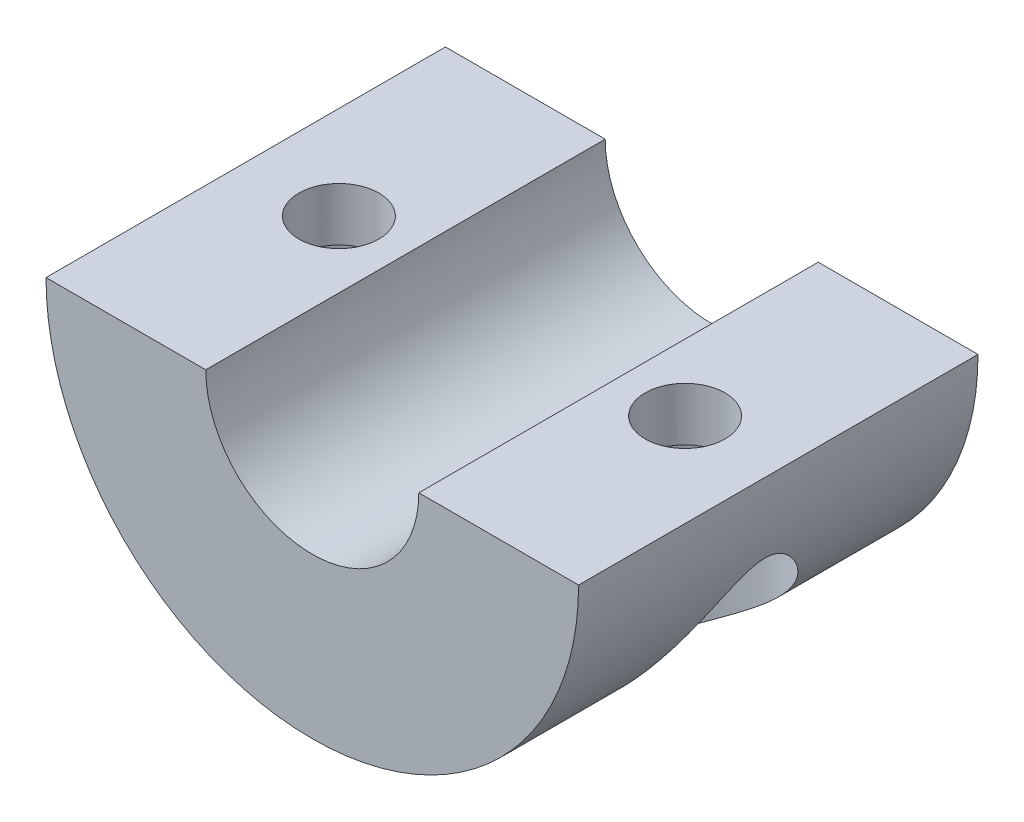
ISO-10303-21;
HEADER;
FILE_DESCRIPTION(('STEP AP214'),'2;1');
FILE_NAME('part.step','',(''),(''),'','','');
FILE_SCHEMA(('AUTOMOTIVE_DESIGN { 1 0 10303 214 1 1 1 1 }'));
ENDSEC;
DATA;
#1=APPLICATION_CONTEXT('core data for automotive mechanical design processes');
#2=APPLICATION_PROTOCOL_DEFINITION('international standard','automotive_design',2000,#1);
#3=PRODUCT_CONTEXT('',#1,'mechanical');
#4=PRODUCT('Part','Part','',(#3));
#5=PRODUCT_RELATED_PRODUCT_CATEGORY('part','',(#4));
#6=PRODUCT_DEFINITION_FORMATION('','',#4);
#7=PRODUCT_DEFINITION_CONTEXT('part definition',#1,'design');
#8=PRODUCT_DEFINITION('design','',#6,#7);
#9=PRODUCT_DEFINITION_SHAPE('','',#8);
#10=(LENGTH_UNIT() NAMED_UNIT(*) SI_UNIT(.MILLI.,.METRE.));
#11=(NAMED_UNIT(*) PLANE_ANGLE_UNIT() SI_UNIT($,.RADIAN.));
#12=(NAMED_UNIT(*) SI_UNIT($,.STERADIAN.) SOLID_ANGLE_UNIT());
#13=UNCERTAINTY_MEASURE_WITH_UNIT(LENGTH_MEASURE(1.E-05),#10,'distance_accuracy_value','');
#14=(GEOMETRIC_REPRESENTATION_CONTEXT(3) GLOBAL_UNCERTAINTY_ASSIGNED_CONTEXT((#13)) GLOBAL_UNIT_ASSIGNED_CONTEXT((#10,
#11,#12)) REPRESENTATION_CONTEXT('',''));
#15=CARTESIAN_POINT('',(0.,0.,0.));
#16=DIRECTION('',(0.,0.,1.));
#17=DIRECTION('',(1.,0.,0.));
#18=AXIS2_PLACEMENT_3D('',#15,#16,#17);
#19=CARTESIAN_POINT('',(0.,0.,15.));
#20=DIRECTION('',(0.,0.,-1.));
#21=DIRECTION('',(-1.,0.,0.));
#22=AXIS2_PLACEMENT_3D('',#19,#20,#21);
#23=CYLINDRICAL_SURFACE('',#22,10.);
#24=CARTESIAN_POINT('',(6.5,-7.59934207678533,10.5));
#25=CARTESIAN_POINT('',(6.59626715384264,-7.51700303567221,10.5000006640346));
#26=CARTESIAN_POINT('',(6.69093967772674,-7.43285082252878,10.4953695217262));
#27=CARTESIAN_POINT('',(6.87661285292257,-7.26141739125339,10.4777271730348));
#28=CARTESIAN_POINT('',(6.96761246144658,-7.1741352976071,10.4647136043123));
#29=CARTESIAN_POINT('',(7.23493475236577,-6.90788942408736,10.4142466292948));
#30=CARTESIAN_POINT('',(7.40518383760093,-6.72486661682442,10.3653736662432));
#31=CARTESIAN_POINT('',(7.68867402631341,-6.39682912863218,10.2575688822087));
#32=CARTESIAN_POINT('',(7.80576283098996,-6.25329061773006,10.203903839753));
#33=CARTESIAN_POINT('',(8.02952394207204,-5.96324296475205,10.0839264255998));
#34=CARTESIAN_POINT('',(8.13619015079449,-5.81673214355232,10.0176067165575));
#35=CARTESIAN_POINT('',(8.33872059113446,-5.52246166128028,9.87371165301168));
#36=CARTESIAN_POINT('',(8.43461119945645,-5.37470604541703,9.79616489548227));
#37=CARTESIAN_POINT('',(8.6159203073229,-5.07897155540084,9.6302551592152));
#38=CARTESIAN_POINT('',(8.70134480448516,-4.93099285877142,9.54189843371511));
#39=CARTESIAN_POINT('',(8.84838760410095,-4.66106986441501,9.36966930513917));
#40=CARTESIAN_POINT('',(8.91160031899074,-4.53889893336957,9.28750591953785));
#41=CARTESIAN_POINT('',(9.03098770854562,-4.29645814872203,9.11408550106013));
#42=CARTESIAN_POINT('',(9.08712627965559,-4.1762005839669,9.02278577446811));
#43=CARTESIAN_POINT('',(9.17172857309055,-3.98569744218155,8.86619503359302));
#44=CARTESIAN_POINT('',(9.20260310486306,-3.9138103581973,8.80420214171844));
#45=CARTESIAN_POINT('',(9.26117854725035,-3.77311146248531,8.67513045035976));
#46=CARTESIAN_POINT('',(9.28887480961871,-3.70430424251208,8.60804443434438));
#47=CARTESIAN_POINT('',(9.34040872293033,-3.57235677276185,8.46829059486594));
#48=CARTESIAN_POINT('',(9.36427848881603,-3.50917158056839,8.39567769719094));
#49=CARTESIAN_POINT('',(9.40764932791933,-3.39117089787046,8.24287329581013));
#50=CARTESIAN_POINT('',(9.42716583046272,-3.33632607385045,8.16271003812605));
#51=CARTESIAN_POINT('',(9.45451038311707,-3.25780812243611,8.02339669252767));
#52=CARTESIAN_POINT('',(9.46402434226795,-3.22999487337996,7.96695371318277));
#53=CARTESIAN_POINT('',(9.48005592757253,-3.18263506455229,7.85030378409398));
#54=CARTESIAN_POINT('',(9.48658008524816,-3.16307049227395,7.7901053687648));
#55=CARTESIAN_POINT('',(9.49530138001083,-3.13678497395271,7.67591748799047));
#56=CARTESIAN_POINT('',(9.49799244555997,-3.12860220966917,7.62231060855095));
#57=CARTESIAN_POINT('',(9.50044997332594,-3.12113263710684,7.51439546101367));
#58=CARTESIAN_POINT('',(9.50021701993901,-3.12184405123191,7.46008733523486));
#59=CARTESIAN_POINT('',(9.49685706368595,-3.13204883911273,7.35255624726779));
#60=CARTESIAN_POINT('',(9.49373686481757,-3.14152156619114,7.29933103437585));
#61=CARTESIAN_POINT('',(9.48492080217995,-3.16803889305328,7.19504804231814));
#62=CARTESIAN_POINT('',(9.47922263955615,-3.18509025071036,7.14399224223662));
#63=CARTESIAN_POINT('',(9.46132809841256,-3.2379699412791,7.01286403189659));
#64=CARTESIAN_POINT('',(9.44730614410694,-3.27883393143574,6.9351019983162));
#65=CARTESIAN_POINT('',(9.41496027653454,-3.37059503779214,6.78668335391714));
#66=CARTESIAN_POINT('',(9.39661941225216,-3.42153155745284,6.71605634910341));
#67=CARTESIAN_POINT('',(9.35042735793383,-3.54614670603331,6.56001648170062));
#68=CARTESIAN_POINT('',(9.32138551893846,-3.62200443626901,6.47672761249256));
#69=CARTESIAN_POINT('',(9.25858023831557,-3.7796759574645,6.3178286441864));
#70=CARTESIAN_POINT('',(9.22480788785814,-3.8615008434825,6.24223350934331));
#71=CARTESIAN_POINT('',(9.15287833256062,-4.02904092446296,6.09684729116866));
#72=CARTESIAN_POINT('',(9.11470088762099,-4.11477288542036,6.02708576222991));
#73=CARTESIAN_POINT('',(9.03436338843595,-4.28829000162744,5.89279458050797));
#74=CARTESIAN_POINT('',(8.99220613709566,-4.3760736795861,5.82826130421026));
#75=CARTESIAN_POINT('',(8.87157124715262,-4.6178511373522,5.6579303976404));
#76=CARTESIAN_POINT('',(8.78916799578506,-4.77309749949032,5.55665649141777));
#77=CARTESIAN_POINT('',(8.61275226204894,-5.08454783167265,5.36620014677272));
#78=CARTESIAN_POINT('',(8.51873054086025,-5.24075246870338,5.27702745079548));
#79=CARTESIAN_POINT('',(8.31932041689995,-5.55183945128257,5.1111003670292));
#80=CARTESIAN_POINT('',(8.21396340470958,-5.70672422889573,5.03431308467524));
#81=CARTESIAN_POINT('',(7.99175387934405,-6.0139723048799,4.89386508317436));
#82=CARTESIAN_POINT('',(7.87490846272541,-6.1663370927674,4.83019633483589));
#83=CARTESIAN_POINT('',(7.57666959505563,-6.532307879117,4.69320325468493));
#84=CARTESIAN_POINT('',(7.38915992478216,-6.74400799656451,4.62754286396326));
#85=CARTESIAN_POINT('',(7.09164529829815,-7.05187937475232,4.55716048999194));
#86=CARTESIAN_POINT('',(6.98979027246551,-7.15286828971545,4.53838547117163));
#87=CARTESIAN_POINT('',(6.78111234837324,-7.35100157323475,4.51134485915088));
#88=CARTESIAN_POINT('',(6.67429082789259,-7.44814699435365,4.5030763691045));
#89=CARTESIAN_POINT('',(6.39833634615838,-7.68830366319808,4.49708687674687));
#90=CARTESIAN_POINT('',(6.22621350041297,-7.82830311707535,4.50728965543184));
#91=CARTESIAN_POINT('',(5.96393083171256,-8.02768199851318,4.54695952978306));
#92=CARTESIAN_POINT('',(5.87583085574082,-8.09236456329553,4.56424029317027));
#93=CARTESIAN_POINT('',(5.69901597336694,-8.21784453660574,4.60747192770032));
#94=CARTESIAN_POINT('',(5.61030116986628,-8.27864257865896,4.63342138074802));
#95=CARTESIAN_POINT('',(5.3743145097719,-8.4349161145622,4.71485109753006));
#96=CARTESIAN_POINT('',(5.22720558761511,-8.52666561390853,4.77850454018129));
#97=CARTESIAN_POINT('',(5.01146503169386,-8.65403305366947,4.8940534751946));
#98=CARTESIAN_POINT('',(4.94034341067357,-8.69479422495471,4.93593619609538));
#99=CARTESIAN_POINT('',(4.80049131796222,-8.77277969980534,5.02642132480074));
#100=CARTESIAN_POINT('',(4.73175971247948,-8.8100056953296,5.07502049044429));
#101=CARTESIAN_POINT('',(4.59709927592574,-8.88102000393527,5.17916830792296));
#102=CARTESIAN_POINT('',(4.53118975729369,-8.91478632781373,5.23475694475193));
#103=CARTESIAN_POINT('',(4.40349349404765,-8.97854861013236,5.35239819792941));
#104=CARTESIAN_POINT('',(4.34170494823738,-9.0085462209371,5.41444795946783));
#105=CARTESIAN_POINT('',(4.22305201854264,-9.06477494868528,5.54468341661882));
#106=CARTESIAN_POINT('',(4.16618789835973,-9.09100586397272,5.61286944042824));
#107=CARTESIAN_POINT('',(4.05819522570229,-9.13972429775995,5.75484705584869));
#108=CARTESIAN_POINT('',(4.00706611764591,-9.16221217897016,5.82863810330695));
#109=CARTESIAN_POINT('',(3.87283746114096,-9.22008601716353,6.0425032265752));
#110=CARTESIAN_POINT('',(3.79692266657876,-9.25138037014034,6.18833746250217));
#111=CARTESIAN_POINT('',(3.66958818177695,-9.30262770811066,6.49207253287504));
#112=CARTESIAN_POINT('',(3.61816180085322,-9.32258379121578,6.64997005771163));
#113=CARTESIAN_POINT('',(3.54361672115193,-9.35116600364364,6.96611505224467));
#114=CARTESIAN_POINT('',(3.51938235107745,-9.36023981739045,7.12405928211684));
#115=CARTESIAN_POINT('',(3.49632743450426,-9.36887698617571,7.44203908175331));
#116=CARTESIAN_POINT('',(3.49750451912467,-9.36844122770583,7.60207445518914));
#117=CARTESIAN_POINT('',(3.52509925333944,-9.35809172532091,7.91824870464915));
#118=CARTESIAN_POINT('',(3.55129999819226,-9.34825942999295,8.07440924294505));
#119=CARTESIAN_POINT('',(3.62759872576983,-9.31891532020625,8.37981905221234));
#120=CARTESIAN_POINT('',(3.67769558661327,-9.29940396016116,8.52906864727969));
#121=CARTESIAN_POINT('',(3.79989955969764,-9.25013971995249,8.81678827788082));
#122=CARTESIAN_POINT('',(3.87204867847548,-9.22036727990168,8.95523710209174));
#123=CARTESIAN_POINT('',(4.03535390132151,-9.15007050794186,9.21737247298131));
#124=CARTESIAN_POINT('',(4.1265093967466,-9.1095465203194,9.34105949217934));
#125=CARTESIAN_POINT('',(4.32579271769409,-9.01663871601212,9.57281976190138));
#126=CARTESIAN_POINT('',(4.43418673615323,-8.9640619635354,9.68058608673868));
#127=CARTESIAN_POINT('',(4.66232393958377,-8.84754923711741,9.87603229853336));
#128=CARTESIAN_POINT('',(4.78206929222544,-8.78361109153821,9.96370833804759));
#129=CARTESIAN_POINT('',(5.03575113427153,-8.64081053994456,10.1229220320811));
#130=CARTESIAN_POINT('',(5.17010806982663,-8.56128676750944,10.193190038055));
#131=CARTESIAN_POINT('',(5.44172101513837,-8.39126712530108,10.3110483033674));
#132=CARTESIAN_POINT('',(5.57897794218784,-8.30076773960438,10.3586312715926));
#133=CARTESIAN_POINT('',(5.84912493781439,-8.112595097033,10.4318048626014));
#134=CARTESIAN_POINT('',(5.98203996481213,-8.01515014237334,10.4579027168877));
#135=CARTESIAN_POINT('',(6.24422105879918,-7.8126273826344,10.4919987947564));
#136=CARTESIAN_POINT('',(6.37348754923774,-7.7075504684208,10.4999991273385));
#137=CARTESIAN_POINT('',(6.5,-7.59934207678533,10.5));
#138=B_SPLINE_CURVE_WITH_KNOTS('',3,(#24,#25,#26,#27,#28,#29,#30,#31,#32,#33,#34,#35,#36,#37,
#38,#39,#40,#41,#42,#43,#44,#45,#46,#47,#48,#49,#50,#51,#52,#53,#54,#55,#56,#57,#58,#59,#60,#61,
#62,#63,#64,#65,#66,#67,#68,#69,#70,#71,#72,#73,#74,#75,#76,#77,#78,#79,#80,#81,#82,#83,#84,#85,
#86,#87,#88,#89,#90,#91,#92,#93,#94,#95,#96,#97,#98,#99,#100,#101,#102,#103,#104,#105,#106,#107,
#108,#109,#110,#111,#112,#113,#114,#115,#116,#117,#118,#119,#120,#121,#122,#123,#124,#125,#126,
#127,#128,#129,#130,#131,#132,#133,#134,#135,#136,#137),.UNSPECIFIED.,.T.,.F.,(4,2,2,2,2,2,2,2,
2,2,2,2,2,2,2,2,2,2,2,2,2,2,2,2,2,2,2,2,2,2,2,2,2,2,2,2,2,2,2,2,2,2,2,2,2,2,2,2,2,2,2,2,2,2,2,2,
4),(0.,0.379875271141809,0.759857645790385,1.52137704889893,2.09927960416235,2.67751825886669,
3.2543091530681,3.83076795502686,4.31110294894101,4.79379782004087,5.09309365086966,
5.3928217712735,5.68988523917638,5.98587847276474,6.17626684446677,6.36623728730627,
6.52837367438081,6.69047765729257,6.85220060093952,7.01406804334216,7.27939037850948,
7.54577194693962,7.8939953230852,8.24288354278009,8.59344392697611,8.94375923405327,
9.55149441766768,10.1597160104145,10.7662946302688,11.3725008839139,12.2399596101564,
12.6734929343532,13.1069066993705,13.7702764258442,14.1018829696336,14.4334352930563,
14.9847505778033,15.2606379559994,15.5363926200574,15.8138034428302,16.0910922092214,
16.3683958151748,16.6456725339739,17.1449845358862,17.6441600382085,18.122006166987,
18.5998077506702,19.0735049916337,19.5471799955198,20.0217629689407,20.4963307470772,
20.9791035186973,21.4619686678657,21.9735464742427,22.485288594268,22.9845715908274,
23.4837964003059),.UNSPECIFIED.);
#139=CARTESIAN_POINT('',(6.5,-7.59934207678533,10.5));
#140=VERTEX_POINT('',#139);
#141=EDGE_CURVE('E113',#140,#140,#138,.T.);
#142=ORIENTED_EDGE('',*,*,#141,.T.);
#143=EDGE_LOOP('',(#142));
#144=FACE_BOUND('',#143,.T.);
#145=CARTESIAN_POINT('',(0.,0.,0.));
#146=DIRECTION('',(0.,0.,1.));
#147=DIRECTION('',(1.,0.,0.));
#148=AXIS2_PLACEMENT_3D('',#145,#146,#147);
#149=CIRCLE('',#148,10.);
#150=CARTESIAN_POINT('',(-10.,0.,0.));
#151=VERTEX_POINT('',#150);
#152=CARTESIAN_POINT('',(10.,0.,0.));
#153=VERTEX_POINT('',#152);
#154=EDGE_CURVE('E110',#151,#153,#149,.T.);
#155=ORIENTED_EDGE('',*,*,#154,.T.);
#156=DIRECTION('',(0.,0.,-1.));
#157=VECTOR('',#156,1.);
#158=CARTESIAN_POINT('',(10.,0.,15.));
#159=LINE('',#158,#157);
#160=CARTESIAN_POINT('',(10.,0.,15.));
#161=VERTEX_POINT('',#160);
#162=EDGE_CURVE('E74',#161,#153,#159,.T.);
#163=ORIENTED_EDGE('',*,*,#162,.F.);
#164=CARTESIAN_POINT('',(0.,0.,15.));
#165=DIRECTION('',(0.,0.,1.));
#166=DIRECTION('',(1.,0.,0.));
#167=AXIS2_PLACEMENT_3D('',#164,#165,#166);
#168=CIRCLE('',#167,10.);
#169=CARTESIAN_POINT('',(-10.,0.,15.));
#170=VERTEX_POINT('',#169);
#171=EDGE_CURVE('E96',#170,#161,#168,.T.);
#172=ORIENTED_EDGE('',*,*,#171,.F.);
#173=DIRECTION('',(0.,0.,-1.));
#174=VECTOR('',#173,1.);
#175=CARTESIAN_POINT('',(-10.,0.,15.));
#176=LINE('',#175,#174);
#177=EDGE_CURVE('E51',#170,#151,#176,.T.);
#178=ORIENTED_EDGE('',*,*,#177,.T.);
#179=EDGE_LOOP('',(#155,#163,#172,#178));
#180=FACE_BOUND('',#179,.T.);
#181=CARTESIAN_POINT('',(-6.5,-7.59934207678533,10.5));
#182=CARTESIAN_POINT('',(-6.59626715384264,-7.51700303567221,10.5000006640346));
#183=CARTESIAN_POINT('',(-6.69093967772674,-7.43285082252878,10.4953695217262));
#184=CARTESIAN_POINT('',(-6.87661285292257,-7.26141739125339,10.4777271730348));
#185=CARTESIAN_POINT('',(-6.96761246144658,-7.1741352976071,10.4647136043123));
#186=CARTESIAN_POINT('',(-7.23493475236577,-6.90788942408736,10.4142466292948));
#187=CARTESIAN_POINT('',(-7.40518383760093,-6.72486661682442,10.3653736662432));
#188=CARTESIAN_POINT('',(-7.68867402631341,-6.39682912863218,10.2575688822087));
#189=CARTESIAN_POINT('',(-7.80576283098996,-6.25329061773006,10.203903839753));
#190=CARTESIAN_POINT('',(-8.02952394207204,-5.96324296475205,10.0839264255998));
#191=CARTESIAN_POINT('',(-8.13619015079449,-5.81673214355232,10.0176067165575));
#192=CARTESIAN_POINT('',(-8.33872059113446,-5.52246166128028,9.87371165301168));
#193=CARTESIAN_POINT('',(-8.43461119945645,-5.37470604541703,9.79616489548227));
#194=CARTESIAN_POINT('',(-8.6159203073229,-5.07897155540084,9.6302551592152));
#195=CARTESIAN_POINT('',(-8.70134480448516,-4.93099285877142,9.54189843371511));
#196=CARTESIAN_POINT('',(-8.84838760410095,-4.66106986441501,9.36966930513917));
#197=CARTESIAN_POINT('',(-8.91160031899074,-4.53889893336957,9.28750591953785));
#198=CARTESIAN_POINT('',(-9.03098770854562,-4.29645814872203,9.11408550106013));
#199=CARTESIAN_POINT('',(-9.08712627965559,-4.1762005839669,9.02278577446811));
#200=CARTESIAN_POINT('',(-9.17172857309055,-3.98569744218155,8.86619503359302));
#201=CARTESIAN_POINT('',(-9.20260310486306,-3.9138103581973,8.80420214171844));
#202=CARTESIAN_POINT('',(-9.26117854725035,-3.77311146248531,8.67513045035976));
#203=CARTESIAN_POINT('',(-9.28887480961871,-3.70430424251208,8.60804443434438));
#204=CARTESIAN_POINT('',(-9.34040872293033,-3.57235677276185,8.46829059486594));
#205=CARTESIAN_POINT('',(-9.36427848881603,-3.50917158056839,8.39567769719094));
#206=CARTESIAN_POINT('',(-9.40764932791933,-3.39117089787046,8.24287329581013));
#207=CARTESIAN_POINT('',(-9.42716583046272,-3.33632607385045,8.16271003812605));
#208=CARTESIAN_POINT('',(-9.45451038311707,-3.25780812243611,8.02339669252767));
#209=CARTESIAN_POINT('',(-9.46402434226795,-3.22999487337996,7.96695371318277));
#210=CARTESIAN_POINT('',(-9.48005592757253,-3.18263506455229,7.85030378409398));
#211=CARTESIAN_POINT('',(-9.48658008524816,-3.16307049227395,7.7901053687648));
#212=CARTESIAN_POINT('',(-9.49530138001083,-3.13678497395271,7.67591748799047));
#213=CARTESIAN_POINT('',(-9.49799244555997,-3.12860220966917,7.62231060855095));
#214=CARTESIAN_POINT('',(-9.50044997332594,-3.12113263710684,7.51439546101367));
#215=CARTESIAN_POINT('',(-9.50021701993901,-3.12184405123191,7.46008733523486));
#216=CARTESIAN_POINT('',(-9.49685706368595,-3.13204883911273,7.35255624726779));
#217=CARTESIAN_POINT('',(-9.49373686481757,-3.14152156619114,7.29933103437585));
#218=CARTESIAN_POINT('',(-9.48492080217995,-3.16803889305328,7.19504804231814));
#219=CARTESIAN_POINT('',(-9.47922263955615,-3.18509025071036,7.14399224223662));
#220=CARTESIAN_POINT('',(-9.46132809841256,-3.2379699412791,7.01286403189659));
#221=CARTESIAN_POINT('',(-9.44730614410694,-3.27883393143574,6.9351019983162));
#222=CARTESIAN_POINT('',(-9.41496027653454,-3.37059503779214,6.78668335391714));
#223=CARTESIAN_POINT('',(-9.39661941225216,-3.42153155745284,6.71605634910341));
#224=CARTESIAN_POINT('',(-9.35042735793383,-3.54614670603331,6.56001648170062));
#225=CARTESIAN_POINT('',(-9.32138551893846,-3.62200443626901,6.47672761249256));
#226=CARTESIAN_POINT('',(-9.25858023831557,-3.7796759574645,6.3178286441864));
#227=CARTESIAN_POINT('',(-9.22480788785814,-3.8615008434825,6.24223350934331));
#228=CARTESIAN_POINT('',(-9.15287833256062,-4.02904092446296,6.09684729116866));
#229=CARTESIAN_POINT('',(-9.11470088762099,-4.11477288542036,6.02708576222991));
#230=CARTESIAN_POINT('',(-9.03436338843595,-4.28829000162744,5.89279458050797));
#231=CARTESIAN_POINT('',(-8.99220613709566,-4.3760736795861,5.82826130421026));
#232=CARTESIAN_POINT('',(-8.87157124715262,-4.6178511373522,5.6579303976404));
#233=CARTESIAN_POINT('',(-8.78916799578506,-4.77309749949032,5.55665649141777));
#234=CARTESIAN_POINT('',(-8.61275226204894,-5.08454783167265,5.36620014677272));
#235=CARTESIAN_POINT('',(-8.51873054086025,-5.24075246870338,5.27702745079548));
#236=CARTESIAN_POINT('',(-8.31932041689995,-5.55183945128257,5.1111003670292));
#237=CARTESIAN_POINT('',(-8.21396340470958,-5.70672422889573,5.03431308467524));
#238=CARTESIAN_POINT('',(-7.99175387934405,-6.0139723048799,4.89386508317436));
#239=CARTESIAN_POINT('',(-7.87490846272541,-6.1663370927674,4.83019633483589));
#240=CARTESIAN_POINT('',(-7.57666959505563,-6.532307879117,4.69320325468493));
#241=CARTESIAN_POINT('',(-7.38915992478216,-6.74400799656451,4.62754286396326));
#242=CARTESIAN_POINT('',(-7.09164529829815,-7.05187937475232,4.55716048999194));
#243=CARTESIAN_POINT('',(-6.98979027246551,-7.15286828971545,4.53838547117163));
#244=CARTESIAN_POINT('',(-6.78111234837324,-7.35100157323475,4.51134485915088));
#245=CARTESIAN_POINT('',(-6.67429082789259,-7.44814699435365,4.5030763691045));
#246=CARTESIAN_POINT('',(-6.39833634615838,-7.68830366319808,4.49708687674687));
#247=CARTESIAN_POINT('',(-6.22621350041297,-7.82830311707535,4.50728965543184));
#248=CARTESIAN_POINT('',(-5.96393083171256,-8.02768199851318,4.54695952978306));
#249=CARTESIAN_POINT('',(-5.87583085574082,-8.09236456329553,4.56424029317027));
#250=CARTESIAN_POINT('',(-5.69901597336694,-8.21784453660574,4.60747192770032));
#251=CARTESIAN_POINT('',(-5.61030116986628,-8.27864257865896,4.63342138074802));
#252=CARTESIAN_POINT('',(-5.3743145097719,-8.4349161145622,4.71485109753006));
#253=CARTESIAN_POINT('',(-5.22720558761511,-8.52666561390853,4.77850454018129));
#254=CARTESIAN_POINT('',(-5.01146503169386,-8.65403305366947,4.8940534751946));
#255=CARTESIAN_POINT('',(-4.94034341067357,-8.69479422495471,4.93593619609538));
#256=CARTESIAN_POINT('',(-4.80049131796222,-8.77277969980534,5.02642132480074));
#257=CARTESIAN_POINT('',(-4.73175971247948,-8.8100056953296,5.07502049044429));
#258=CARTESIAN_POINT('',(-4.59709927592574,-8.88102000393527,5.17916830792296));
#259=CARTESIAN_POINT('',(-4.53118975729369,-8.91478632781373,5.23475694475193));
#260=CARTESIAN_POINT('',(-4.40349349404765,-8.97854861013236,5.35239819792941));
#261=CARTESIAN_POINT('',(-4.34170494823738,-9.0085462209371,5.41444795946783));
#262=CARTESIAN_POINT('',(-4.22305201854264,-9.06477494868528,5.54468341661882));
#263=CARTESIAN_POINT('',(-4.16618789835973,-9.09100586397272,5.61286944042824));
#264=CARTESIAN_POINT('',(-4.05819522570229,-9.13972429775995,5.75484705584869));
#265=CARTESIAN_POINT('',(-4.00706611764591,-9.16221217897016,5.82863810330695));
#266=CARTESIAN_POINT('',(-3.87283746114096,-9.22008601716353,6.0425032265752));
#267=CARTESIAN_POINT('',(-3.79692266657876,-9.25138037014034,6.18833746250217));
#268=CARTESIAN_POINT('',(-3.66958818177695,-9.30262770811066,6.49207253287504));
#269=CARTESIAN_POINT('',(-3.61816180085322,-9.32258379121578,6.64997005771163));
#270=CARTESIAN_POINT('',(-3.54361672115193,-9.35116600364364,6.96611505224467));
#271=CARTESIAN_POINT('',(-3.51938235107745,-9.36023981739045,7.12405928211684));
#272=CARTESIAN_POINT('',(-3.49632743450426,-9.36887698617571,7.44203908175331));
#273=CARTESIAN_POINT('',(-3.49750451912467,-9.36844122770583,7.60207445518914));
#274=CARTESIAN_POINT('',(-3.52509925333944,-9.35809172532091,7.91824870464915));
#275=CARTESIAN_POINT('',(-3.55129999819226,-9.34825942999295,8.07440924294505));
#276=CARTESIAN_POINT('',(-3.62759872576983,-9.31891532020625,8.37981905221234));
#277=CARTESIAN_POINT('',(-3.67769558661327,-9.29940396016116,8.52906864727969));
#278=CARTESIAN_POINT('',(-3.79989955969764,-9.25013971995249,8.81678827788082));
#279=CARTESIAN_POINT('',(-3.87204867847548,-9.22036727990168,8.95523710209174));
#280=CARTESIAN_POINT('',(-4.03535390132151,-9.15007050794186,9.21737247298131));
#281=CARTESIAN_POINT('',(-4.1265093967466,-9.1095465203194,9.34105949217934));
#282=CARTESIAN_POINT('',(-4.32579271769409,-9.01663871601212,9.57281976190138));
#283=CARTESIAN_POINT('',(-4.43418673615323,-8.9640619635354,9.68058608673868));
#284=CARTESIAN_POINT('',(-4.66232393958377,-8.84754923711741,9.87603229853336));
#285=CARTESIAN_POINT('',(-4.78206929222544,-8.78361109153821,9.96370833804759));
#286=CARTESIAN_POINT('',(-5.03575113427153,-8.64081053994456,10.1229220320811));
#287=CARTESIAN_POINT('',(-5.17010806982663,-8.56128676750944,10.193190038055));
#288=CARTESIAN_POINT('',(-5.44172101513837,-8.39126712530108,10.3110483033674));
#289=CARTESIAN_POINT('',(-5.57897794218784,-8.30076773960438,10.3586312715926));
#290=CARTESIAN_POINT('',(-5.84912493781439,-8.112595097033,10.4318048626014));
#291=CARTESIAN_POINT('',(-5.98203996481213,-8.01515014237334,10.4579027168877));
#292=CARTESIAN_POINT('',(-6.24422105879918,-7.8126273826344,10.4919987947564));
#293=CARTESIAN_POINT('',(-6.37348754923774,-7.7075504684208,10.4999991273385));
#294=CARTESIAN_POINT('',(-6.5,-7.59934207678533,10.5));
#295=B_SPLINE_CURVE_WITH_KNOTS('',3,(#181,#182,#183,#184,#185,#186,#187,#188,#189,#190,#191,
#192,#193,#194,#195,#196,#197,#198,#199,#200,#201,#202,#203,#204,#205,#206,#207,#208,#209,#210,
#211,#212,#213,#214,#215,#216,#217,#218,#219,#220,#221,#222,#223,#224,#225,#226,#227,#228,#229,
#230,#231,#232,#233,#234,#235,#236,#237,#238,#239,#240,#241,#242,#243,#244,#245,#246,#247,#248,
#249,#250,#251,#252,#253,#254,#255,#256,#257,#258,#259,#260,#261,#262,#263,#264,#265,#266,#267,
#268,#269,#270,#271,#272,#273,#274,#275,#276,#277,#278,#279,#280,#281,#282,#283,#284,#285,#286,
#287,#288,#289,#290,#291,#292,#293,#294),.UNSPECIFIED.,.T.,.F.,(4,2,2,2,2,2,2,2,2,2,2,2,2,2,2,2,
2,2,2,2,2,2,2,2,2,2,2,2,2,2,2,2,2,2,2,2,2,2,2,2,2,2,2,2,2,2,2,2,2,2,2,2,2,2,2,2,4),(0.,
0.379875271141809,0.759857645790385,1.52137704889893,2.09927960416235,2.67751825886669,
3.2543091530681,3.83076795502686,4.31110294894101,4.79379782004087,5.09309365086966,
5.3928217712735,5.68988523917638,5.98587847276474,6.17626684446677,6.36623728730627,
6.52837367438081,6.69047765729257,6.85220060093952,7.01406804334216,7.27939037850948,
7.54577194693962,7.8939953230852,8.24288354278009,8.59344392697611,8.94375923405327,
9.55149441766768,10.1597160104145,10.7662946302688,11.3725008839139,12.2399596101564,
12.6734929343532,13.1069066993705,13.7702764258442,14.1018829696336,14.4334352930563,
14.9847505778033,15.2606379559994,15.5363926200574,15.8138034428302,16.0910922092214,
16.3683958151748,16.6456725339739,17.1449845358862,17.6441600382085,18.122006166987,
18.5998077506702,19.0735049916337,19.5471799955198,20.0217629689407,20.4963307470772,
20.9791035186973,21.4619686678657,21.9735464742427,22.485288594268,22.9845715908274,
23.4837964003059),.UNSPECIFIED.);
#296=CARTESIAN_POINT('',(-6.5,-7.59934207678533,10.5));
#297=VERTEX_POINT('',#296);
#298=EDGE_CURVE('E204',#297,#297,#295,.T.);
#299=ORIENTED_EDGE('',*,*,#298,.F.);
#300=EDGE_LOOP('',(#299));
#301=FACE_BOUND('',#300,.T.);
#302=ADVANCED_FACE('F41',(#144,#180,#301),#23,.T.);
#303=CARTESIAN_POINT('',(0.,0.,15.));
#304=DIRECTION('',(0.,0.,-1.));
#305=DIRECTION('',(-1.,0.,0.));
#306=AXIS2_PLACEMENT_3D('',#303,#304,#305);
#307=CYLINDRICAL_SURFACE('',#306,4.);
#308=CARTESIAN_POINT('',(0.,0.,0.));
#309=DIRECTION('',(0.,0.,1.));
#310=DIRECTION('',(1.,0.,0.));
#311=AXIS2_PLACEMENT_3D('',#308,#309,#310);
#312=CIRCLE('',#311,4.);
#313=CARTESIAN_POINT('',(-4.,0.,0.));
#314=VERTEX_POINT('',#313);
#315=CARTESIAN_POINT('',(4.,0.,0.));
#316=VERTEX_POINT('',#315);
#317=EDGE_CURVE('E119',#314,#316,#312,.T.);
#318=ORIENTED_EDGE('',*,*,#317,.F.);
#319=DIRECTION('',(0.,0.,-1.));
#320=VECTOR('',#319,1.);
#321=CARTESIAN_POINT('',(-4.,0.,15.));
#322=LINE('',#321,#320);
#323=CARTESIAN_POINT('',(-4.,0.,15.));
#324=VERTEX_POINT('',#323);
#325=EDGE_CURVE('E11',#324,#314,#322,.T.);
#326=ORIENTED_EDGE('',*,*,#325,.F.);
#327=CARTESIAN_POINT('',(0.,0.,15.));
#328=DIRECTION('',(0.,0.,1.));
#329=DIRECTION('',(1.,0.,0.));
#330=AXIS2_PLACEMENT_3D('',#327,#328,#329);
#331=CIRCLE('',#330,4.);
#332=CARTESIAN_POINT('',(4.,0.,15.));
#333=VERTEX_POINT('',#332);
#334=EDGE_CURVE('E103',#324,#333,#331,.T.);
#335=ORIENTED_EDGE('',*,*,#334,.T.);
#336=DIRECTION('',(0.,0.,-1.));
#337=VECTOR('',#336,1.);
#338=CARTESIAN_POINT('',(4.,0.,15.));
#339=LINE('',#338,#337);
#340=EDGE_CURVE('E60',#333,#316,#339,.T.);
#341=ORIENTED_EDGE('',*,*,#340,.T.);
#342=EDGE_LOOP('',(#318,#326,#335,#341));
#343=FACE_BOUND('',#342,.T.);
#344=ADVANCED_FACE('F43',(#343),#307,.F.);
#345=CARTESIAN_POINT('',(0.,0.,15.));
#346=DIRECTION('',(0.,1.,0.));
#347=DIRECTION('',(0.,0.,1.));
#348=AXIS2_PLACEMENT_3D('',#345,#346,#347);
#349=PLANE('',#348);
#350=CARTESIAN_POINT('',(-6.5,0.,7.5));
#351=DIRECTION('',(0.,1.,0.));
#352=DIRECTION('',(0.,0.,1.));
#353=AXIS2_PLACEMENT_3D('',#350,#351,#352);
#354=CIRCLE('',#353,1.5);
#355=CARTESIAN_POINT('',(-6.5,0.,9.));
#356=VERTEX_POINT('',#355);
#357=EDGE_CURVE('E45',#356,#356,#354,.F.);
#358=ORIENTED_EDGE('',*,*,#357,.T.);
#359=EDGE_LOOP('',(#358));
#360=FACE_BOUND('',#359,.T.);
#361=DIRECTION('',(1.,0.,0.));
#362=VECTOR('',#361,1.);
#363=CARTESIAN_POINT('',(0.,0.,0.));
#364=LINE('',#363,#362);
#365=EDGE_CURVE('E92',#151,#314,#364,.T.);
#366=ORIENTED_EDGE('',*,*,#365,.F.);
#367=ORIENTED_EDGE('',*,*,#177,.F.);
#368=DIRECTION('',(1.,0.,0.));
#369=VECTOR('',#368,1.);
#370=CARTESIAN_POINT('',(0.,0.,15.));
#371=LINE('',#370,#369);
#372=EDGE_CURVE('E90',#170,#324,#371,.T.);
#373=ORIENTED_EDGE('',*,*,#372,.T.);
#374=ORIENTED_EDGE('',*,*,#325,.T.);
#375=EDGE_LOOP('',(#366,#367,#373,#374));
#376=FACE_BOUND('',#375,.T.);
#377=ADVANCED_FACE('F88',(#360,#376),#349,.T.);
#378=CARTESIAN_POINT('',(6.5,0.,7.5));
#379=DIRECTION('',(0.,1.,0.));
#380=DIRECTION('',(0.,0.,1.));
#381=AXIS2_PLACEMENT_3D('',#378,#379,#380);
#382=CIRCLE('',#381,1.5);
#383=CARTESIAN_POINT('',(6.5,0.,9.));
#384=VERTEX_POINT('',#383);
#385=EDGE_CURVE('E121',#384,#384,#382,.T.);
#386=ORIENTED_EDGE('',*,*,#385,.F.);
#387=EDGE_LOOP('',(#386));
#388=FACE_BOUND('',#387,.T.);
#389=EDGE_CURVE('E105',#316,#153,#364,.T.);
#390=ORIENTED_EDGE('',*,*,#389,.F.);
#391=ORIENTED_EDGE('',*,*,#340,.F.);
#392=EDGE_CURVE('E100',#333,#161,#371,.T.);
#393=ORIENTED_EDGE('',*,*,#392,.T.);
#394=ORIENTED_EDGE('',*,*,#162,.T.);
#395=EDGE_LOOP('',(#390,#391,#393,#394));
#396=FACE_BOUND('',#395,.T.);
#397=ADVANCED_FACE('F135',(#388,#396),#349,.T.);
#398=CARTESIAN_POINT('',(0.,0.,15.));
#399=DIRECTION('',(0.,0.,1.));
#400=DIRECTION('',(1.,0.,0.));
#401=AXIS2_PLACEMENT_3D('',#398,#399,#400);
#402=PLANE('',#401);
#403=ORIENTED_EDGE('',*,*,#334,.F.);
#404=ORIENTED_EDGE('',*,*,#372,.F.);
#405=ORIENTED_EDGE('',*,*,#171,.T.);
#406=ORIENTED_EDGE('',*,*,#392,.F.);
#407=EDGE_LOOP('',(#403,#404,#405,#406));
#408=FACE_BOUND('',#407,.T.);
#409=ADVANCED_FACE('F102',(#408),#402,.T.);
#410=CARTESIAN_POINT('',(0.,0.,0.));
#411=DIRECTION('',(0.,0.,1.));
#412=DIRECTION('',(1.,0.,0.));
#413=AXIS2_PLACEMENT_3D('',#410,#411,#412);
#414=PLANE('',#413);
#415=ORIENTED_EDGE('',*,*,#317,.T.);
#416=ORIENTED_EDGE('',*,*,#389,.T.);
#417=ORIENTED_EDGE('',*,*,#154,.F.);
#418=ORIENTED_EDGE('',*,*,#365,.T.);
#419=EDGE_LOOP('',(#415,#416,#417,#418));
#420=FACE_BOUND('',#419,.T.);
#421=ADVANCED_FACE('F130',(#420),#414,.F.);
#422=CARTESIAN_POINT('',(6.5,-17.,7.5));
#423=DIRECTION('',(0.,1.,0.));
#424=DIRECTION('',(0.,0.,1.));
#425=AXIS2_PLACEMENT_3D('',#422,#423,#424);
#426=CYLINDRICAL_SURFACE('',#425,3.);
#427=CARTESIAN_POINT('',(6.5,-2.,7.5));
#428=DIRECTION('',(0.,1.,0.));
#429=DIRECTION('',(0.,0.,1.));
#430=AXIS2_PLACEMENT_3D('',#427,#428,#429);
#431=CIRCLE('',#430,3.);
#432=CARTESIAN_POINT('',(6.5,-2.,10.5));
#433=VERTEX_POINT('',#432);
#434=EDGE_CURVE('E120',#433,#433,#431,.T.);
#435=ORIENTED_EDGE('',*,*,#434,.T.);
#436=EDGE_LOOP('',(#435));
#437=FACE_BOUND('',#436,.T.);
#438=ORIENTED_EDGE('',*,*,#141,.F.);
#439=EDGE_LOOP('',(#438));
#440=FACE_BOUND('',#439,.T.);
#441=ADVANCED_FACE('F124',(#437,#440),#426,.F.);
#442=CARTESIAN_POINT('',(6.5,-2.,7.5));
#443=DIRECTION('',(0.,1.,0.));
#444=DIRECTION('',(0.,0.,1.));
#445=AXIS2_PLACEMENT_3D('',#442,#443,#444);
#446=PLANE('',#445);
#447=CARTESIAN_POINT('',(6.5,-2.,7.5));
#448=DIRECTION('',(0.,-1.,0.));
#449=DIRECTION('',(0.,0.,-1.));
#450=AXIS2_PLACEMENT_3D('',#447,#448,#449);
#451=CIRCLE('',#450,1.5);
#452=CARTESIAN_POINT('',(6.5,-2.,6.));
#453=VERTEX_POINT('',#452);
#454=EDGE_CURVE('E208',#453,#453,#451,.T.);
#455=ORIENTED_EDGE('',*,*,#454,.F.);
#456=EDGE_LOOP('',(#455));
#457=FACE_BOUND('',#456,.T.);
#458=ORIENTED_EDGE('',*,*,#434,.F.);
#459=EDGE_LOOP('',(#458));
#460=FACE_BOUND('',#459,.T.);
#461=ADVANCED_FACE('F129',(#457,#460),#446,.F.);
#462=CARTESIAN_POINT('',(6.5,13.,7.5));
#463=DIRECTION('',(0.,-1.,0.));
#464=DIRECTION('',(0.,0.,-1.));
#465=AXIS2_PLACEMENT_3D('',#462,#463,#464);
#466=CYLINDRICAL_SURFACE('',#465,1.5);
#467=ORIENTED_EDGE('',*,*,#385,.T.);
#468=EDGE_LOOP('',(#467));
#469=FACE_BOUND('',#468,.T.);
#470=ORIENTED_EDGE('',*,*,#454,.T.);
#471=EDGE_LOOP('',(#470));
#472=FACE_BOUND('',#471,.T.);
#473=ADVANCED_FACE('F176',(#469,#472),#466,.F.);
#474=CARTESIAN_POINT('',(-6.5,-17.,7.5));
#475=DIRECTION('',(0.,1.,0.));
#476=DIRECTION('',(0.,0.,1.));
#477=AXIS2_PLACEMENT_3D('',#474,#475,#476);
#478=CYLINDRICAL_SURFACE('',#477,3.);
#479=CARTESIAN_POINT('',(-6.5,-2.,7.5));
#480=DIRECTION('',(0.,-1.,0.));
#481=DIRECTION('',(0.,0.,1.));
#482=AXIS2_PLACEMENT_3D('',#479,#480,#481);
#483=CIRCLE('',#482,3.);
#484=CARTESIAN_POINT('',(-6.5,-2.,10.5));
#485=VERTEX_POINT('',#484);
#486=EDGE_CURVE('E209',#485,#485,#483,.T.);
#487=ORIENTED_EDGE('',*,*,#486,.F.);
#488=EDGE_LOOP('',(#487));
#489=FACE_BOUND('',#488,.T.);
#490=ORIENTED_EDGE('',*,*,#298,.T.);
#491=EDGE_LOOP('',(#490));
#492=FACE_BOUND('',#491,.T.);
#493=ADVANCED_FACE('F170',(#489,#492),#478,.F.);
#494=CARTESIAN_POINT('',(-6.5,-2.,7.5));
#495=DIRECTION('',(0.,1.,0.));
#496=DIRECTION('',(0.,0.,1.));
#497=AXIS2_PLACEMENT_3D('',#494,#495,#496);
#498=PLANE('',#497);
#499=CARTESIAN_POINT('',(-6.5,-2.,7.5));
#500=DIRECTION('',(0.,1.,0.));
#501=DIRECTION('',(0.,0.,-1.));
#502=AXIS2_PLACEMENT_3D('',#499,#500,#501);
#503=CIRCLE('',#502,1.5);
#504=CARTESIAN_POINT('',(-6.5,-2.,6.));
#505=VERTEX_POINT('',#504);
#506=EDGE_CURVE('E219',#505,#505,#503,.T.);
#507=ORIENTED_EDGE('',*,*,#506,.T.);
#508=EDGE_LOOP('',(#507));
#509=FACE_BOUND('',#508,.T.);
#510=ORIENTED_EDGE('',*,*,#486,.T.);
#511=EDGE_LOOP('',(#510));
#512=FACE_BOUND('',#511,.T.);
#513=ADVANCED_FACE('F175',(#509,#512),#498,.F.);
#514=CARTESIAN_POINT('',(-6.5,13.,7.5));
#515=DIRECTION('',(0.,-1.,0.));
#516=DIRECTION('',(0.,0.,-1.));
#517=AXIS2_PLACEMENT_3D('',#514,#515,#516);
#518=CYLINDRICAL_SURFACE('',#517,1.5);
#519=ORIENTED_EDGE('',*,*,#357,.F.);
#520=EDGE_LOOP('',(#519));
#521=FACE_BOUND('',#520,.T.);
#522=ORIENTED_EDGE('',*,*,#506,.F.);
#523=EDGE_LOOP('',(#522));
#524=FACE_BOUND('',#523,.T.);
#525=ADVANCED_FACE('F187',(#521,#524),#518,.F.);
#526=CLOSED_SHELL('',(#302,#344,#377,#397,#409,#421,#441,#461,#473,#493,#513,#525));
#527=MANIFOLD_SOLID_BREP('B2',#526);
#528=ADVANCED_BREP_SHAPE_REPRESENTATION('',(#18,#527),#14);
#529=SHAPE_DEFINITION_REPRESENTATION(#9,#528);
ENDSEC;
END-ISO-10303-21;
